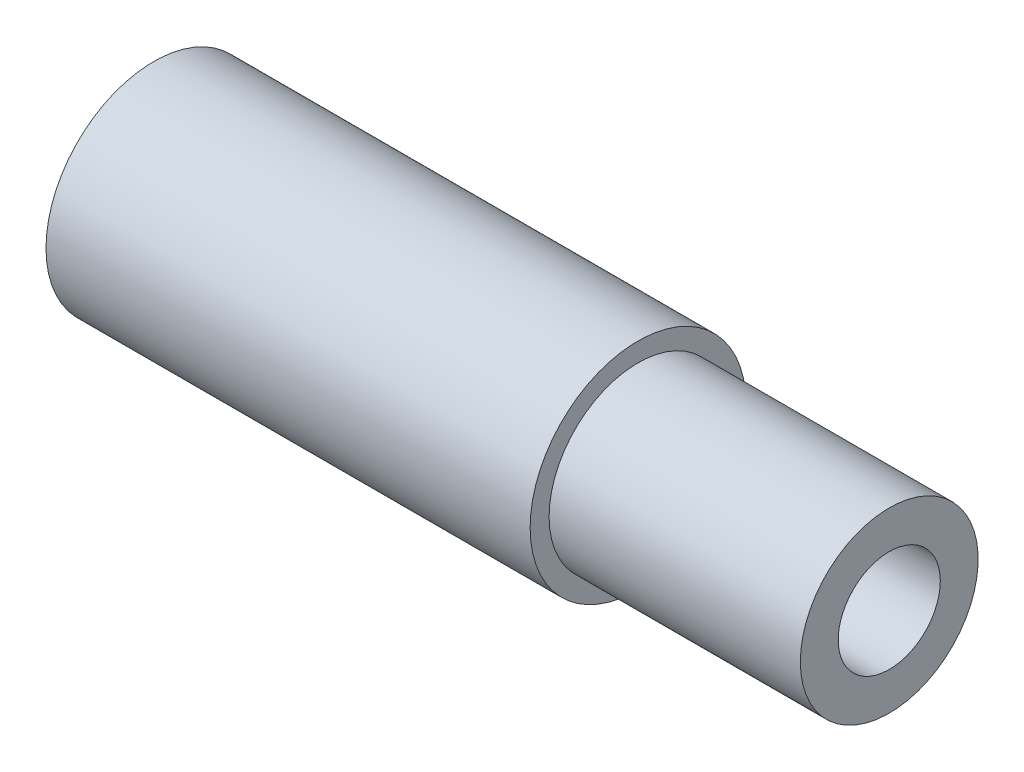
ISO-10303-21;
HEADER;
FILE_DESCRIPTION(('STEP AP214'),'2;1');
FILE_NAME('part.step','',(''),(''),'','','');
FILE_SCHEMA(('AUTOMOTIVE_DESIGN { 1 0 10303 214 1 1 1 1 }'));
ENDSEC;
DATA;
#1=APPLICATION_CONTEXT('core data for automotive mechanical design processes');
#2=APPLICATION_PROTOCOL_DEFINITION('international standard','automotive_design',2000,#1);
#3=PRODUCT_CONTEXT('',#1,'mechanical');
#4=PRODUCT('Part','Part','',(#3));
#5=PRODUCT_RELATED_PRODUCT_CATEGORY('part','',(#4));
#6=PRODUCT_DEFINITION_FORMATION('','',#4);
#7=PRODUCT_DEFINITION_CONTEXT('part definition',#1,'design');
#8=PRODUCT_DEFINITION('design','',#6,#7);
#9=PRODUCT_DEFINITION_SHAPE('','',#8);
#10=(LENGTH_UNIT() NAMED_UNIT(*) SI_UNIT(.MILLI.,.METRE.));
#11=(NAMED_UNIT(*) PLANE_ANGLE_UNIT() SI_UNIT($,.RADIAN.));
#12=(NAMED_UNIT(*) SI_UNIT($,.STERADIAN.) SOLID_ANGLE_UNIT());
#13=UNCERTAINTY_MEASURE_WITH_UNIT(LENGTH_MEASURE(1.E-05),#10,'distance_accuracy_value','');
#14=(GEOMETRIC_REPRESENTATION_CONTEXT(3) GLOBAL_UNCERTAINTY_ASSIGNED_CONTEXT((#13)) GLOBAL_UNIT_ASSIGNED_CONTEXT((#10,
#11,#12)) REPRESENTATION_CONTEXT('',''));
#15=CARTESIAN_POINT('',(0.,0.,0.));
#16=DIRECTION('',(0.,0.,1.));
#17=DIRECTION('',(1.,0.,0.));
#18=AXIS2_PLACEMENT_3D('',#15,#16,#17);
#19=CARTESIAN_POINT('',(0.,0.,0.));
#20=DIRECTION('',(-1.,0.,0.));
#21=DIRECTION('',(0.,0.,1.));
#22=AXIS2_PLACEMENT_3D('',#19,#20,#21);
#23=PLANE('',#22);
#24=CARTESIAN_POINT('',(0.,0.,0.));
#25=DIRECTION('',(-1.,0.,0.));
#26=DIRECTION('',(0.,0.,1.));
#27=AXIS2_PLACEMENT_3D('',#24,#25,#26);
#28=CIRCLE('',#27,2.3876);
#29=CARTESIAN_POINT('',(0.,0.,2.3876));
#30=VERTEX_POINT('',#29);
#31=EDGE_CURVE('E11',#30,#30,#28,.T.);
#32=ORIENTED_EDGE('',*,*,#31,.T.);
#33=EDGE_LOOP('',(#32));
#34=FACE_BOUND('',#33,.T.);
#35=ADVANCED_FACE('F38',(#34),#23,.T.);
#36=CARTESIAN_POINT('',(0.,0.,0.));
#37=DIRECTION('',(-1.,0.,0.));
#38=DIRECTION('',(0.,0.,1.));
#39=AXIS2_PLACEMENT_3D('',#36,#37,#38);
#40=CYLINDRICAL_SURFACE('',#39,2.3876);
#41=CARTESIAN_POINT('',(10.7188,0.,0.));
#42=DIRECTION('',(-1.,0.,0.));
#43=DIRECTION('',(0.,0.,1.));
#44=AXIS2_PLACEMENT_3D('',#41,#42,#43);
#45=CIRCLE('',#44,2.3876);
#46=CARTESIAN_POINT('',(10.7188,0.,2.3876));
#47=VERTEX_POINT('',#46);
#48=EDGE_CURVE('E44',#47,#47,#45,.T.);
#49=ORIENTED_EDGE('',*,*,#48,.T.);
#50=EDGE_LOOP('',(#49));
#51=FACE_BOUND('',#50,.T.);
#52=ORIENTED_EDGE('',*,*,#31,.F.);
#53=EDGE_LOOP('',(#52));
#54=FACE_BOUND('',#53,.T.);
#55=ADVANCED_FACE('F70',(#51,#54),#40,.T.);
#56=CARTESIAN_POINT('',(10.7188,-2.3876,0.));
#57=DIRECTION('',(1.,0.,0.));
#58=DIRECTION('',(0.,0.,-1.));
#59=AXIS2_PLACEMENT_3D('',#56,#57,#58);
#60=PLANE('',#59);
#61=CARTESIAN_POINT('',(10.7188,0.,0.));
#62=DIRECTION('',(-1.,0.,0.));
#63=DIRECTION('',(0.,0.,1.));
#64=AXIS2_PLACEMENT_3D('',#61,#62,#63);
#65=CIRCLE('',#64,1.9685);
#66=CARTESIAN_POINT('',(10.7188,0.,1.9685));
#67=VERTEX_POINT('',#66);
#68=EDGE_CURVE('E61',#67,#67,#65,.T.);
#69=ORIENTED_EDGE('',*,*,#68,.T.);
#70=EDGE_LOOP('',(#69));
#71=FACE_BOUND('',#70,.T.);
#72=ORIENTED_EDGE('',*,*,#48,.F.);
#73=EDGE_LOOP('',(#72));
#74=FACE_BOUND('',#73,.T.);
#75=ADVANCED_FACE('F73',(#71,#74),#60,.T.);
#76=CARTESIAN_POINT('',(0.,0.,0.));
#77=DIRECTION('',(-1.,0.,0.));
#78=DIRECTION('',(0.,0.,1.));
#79=AXIS2_PLACEMENT_3D('',#76,#77,#78);
#80=CYLINDRICAL_SURFACE('',#79,1.9685);
#81=CARTESIAN_POINT('',(16.2814,0.,0.));
#82=DIRECTION('',(-1.,0.,0.));
#83=DIRECTION('',(0.,0.,1.));
#84=AXIS2_PLACEMENT_3D('',#81,#82,#83);
#85=CIRCLE('',#84,1.9685);
#86=CARTESIAN_POINT('',(16.2814,0.,1.9685));
#87=VERTEX_POINT('',#86);
#88=EDGE_CURVE('E57',#87,#87,#85,.T.);
#89=ORIENTED_EDGE('',*,*,#88,.T.);
#90=EDGE_LOOP('',(#89));
#91=FACE_BOUND('',#90,.T.);
#92=ORIENTED_EDGE('',*,*,#68,.F.);
#93=EDGE_LOOP('',(#92));
#94=FACE_BOUND('',#93,.T.);
#95=ADVANCED_FACE('F75',(#91,#94),#80,.T.);
#96=CARTESIAN_POINT('',(16.2814,-1.9685,0.));
#97=DIRECTION('',(1.,0.,0.));
#98=DIRECTION('',(0.,0.,-1.));
#99=AXIS2_PLACEMENT_3D('',#96,#97,#98);
#100=PLANE('',#99);
#101=CARTESIAN_POINT('',(16.2814,0.,0.));
#102=DIRECTION('',(1.,0.,0.));
#103=DIRECTION('',(0.,0.,-1.));
#104=AXIS2_PLACEMENT_3D('',#101,#102,#103);
#105=CIRCLE('',#104,1.13029999999999);
#106=CARTESIAN_POINT('',(16.2814,0.,-1.13029999999999));
#107=VERTEX_POINT('',#106);
#108=EDGE_CURVE('E58',#107,#107,#105,.T.);
#109=ORIENTED_EDGE('',*,*,#108,.F.);
#110=EDGE_LOOP('',(#109));
#111=FACE_BOUND('',#110,.T.);
#112=ORIENTED_EDGE('',*,*,#88,.F.);
#113=EDGE_LOOP('',(#112));
#114=FACE_BOUND('',#113,.T.);
#115=ADVANCED_FACE('F51',(#111,#114),#100,.T.);
#116=CARTESIAN_POINT('',(11.2014,0.,0.));
#117=DIRECTION('',(1.,0.,0.));
#118=DIRECTION('',(0.,0.,-1.));
#119=AXIS2_PLACEMENT_3D('',#116,#117,#118);
#120=CONICAL_SURFACE('',#119,1.1303,1.02974425867665);
#121=CARTESIAN_POINT('',(10.5222472423132,0.,0.));
#122=VERTEX_POINT('',#121);
#123=VERTEX_LOOP('',#122);
#124=FACE_BOUND('',#123,.T.);
#125=CARTESIAN_POINT('',(11.2014,0.,0.));
#126=DIRECTION('',(1.,0.,0.));
#127=DIRECTION('',(0.,0.,-1.));
#128=AXIS2_PLACEMENT_3D('',#125,#126,#127);
#129=CIRCLE('',#128,1.1303);
#130=CARTESIAN_POINT('',(11.2014,0.,-1.1303));
#131=VERTEX_POINT('',#130);
#132=EDGE_CURVE('E55',#131,#131,#129,.T.);
#133=ORIENTED_EDGE('',*,*,#132,.T.);
#134=EDGE_LOOP('',(#133));
#135=FACE_BOUND('',#134,.T.);
#136=ADVANCED_FACE('F47',(#124,#135),#120,.F.);
#137=CARTESIAN_POINT('',(16.2814,0.,0.));
#138=DIRECTION('',(1.,0.,0.));
#139=DIRECTION('',(0.,0.,-1.));
#140=AXIS2_PLACEMENT_3D('',#137,#138,#139);
#141=CYLINDRICAL_SURFACE('',#140,1.13029999999999);
#142=ORIENTED_EDGE('',*,*,#132,.F.);
#143=EDGE_LOOP('',(#142));
#144=FACE_BOUND('',#143,.T.);
#145=ORIENTED_EDGE('',*,*,#108,.T.);
#146=EDGE_LOOP('',(#145));
#147=FACE_BOUND('',#146,.T.);
#148=ADVANCED_FACE('F50',(#144,#147),#141,.F.);
#149=CLOSED_SHELL('',(#35,#55,#75,#95,#115,#136,#148));
#150=MANIFOLD_SOLID_BREP('B2',#149);
#151=ADVANCED_BREP_SHAPE_REPRESENTATION('',(#18,#150),#14);
#152=SHAPE_DEFINITION_REPRESENTATION(#9,#151);
ENDSEC;
END-ISO-10303-21;
